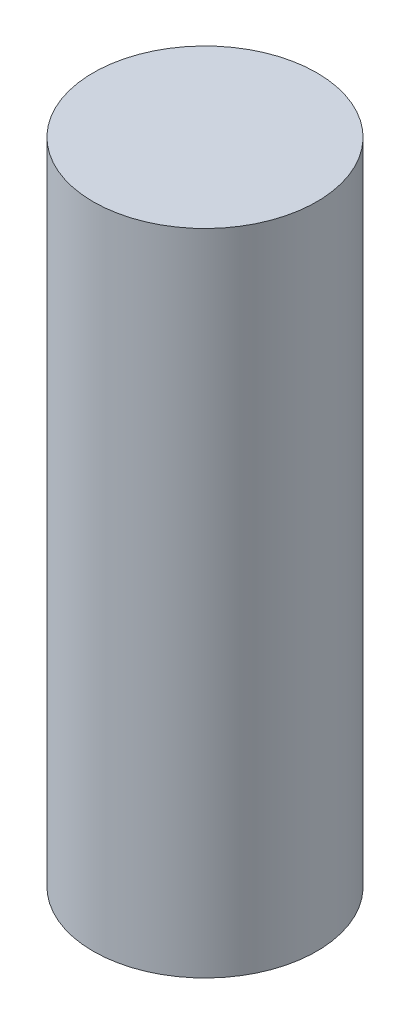
ISO-10303-21;
HEADER;
FILE_DESCRIPTION(('STEP AP214'),'2;1');
FILE_NAME('part.step','',(''),(''),'','','');
FILE_SCHEMA(('AUTOMOTIVE_DESIGN { 1 0 10303 214 1 1 1 1 }'));
ENDSEC;
DATA;
#1=APPLICATION_CONTEXT('core data for automotive mechanical design processes');
#2=APPLICATION_PROTOCOL_DEFINITION('international standard','automotive_design',2000,#1);
#3=PRODUCT_CONTEXT('',#1,'mechanical');
#4=PRODUCT('Part','Part','',(#3));
#5=PRODUCT_RELATED_PRODUCT_CATEGORY('part','',(#4));
#6=PRODUCT_DEFINITION_FORMATION('','',#4);
#7=PRODUCT_DEFINITION_CONTEXT('part definition',#1,'design');
#8=PRODUCT_DEFINITION('design','',#6,#7);
#9=PRODUCT_DEFINITION_SHAPE('','',#8);
#10=(LENGTH_UNIT() NAMED_UNIT(*) SI_UNIT(.MILLI.,.METRE.));
#11=(NAMED_UNIT(*) PLANE_ANGLE_UNIT() SI_UNIT($,.RADIAN.));
#12=(NAMED_UNIT(*) SI_UNIT($,.STERADIAN.) SOLID_ANGLE_UNIT());
#13=UNCERTAINTY_MEASURE_WITH_UNIT(LENGTH_MEASURE(1.E-05),#10,'distance_accuracy_value','');
#14=(GEOMETRIC_REPRESENTATION_CONTEXT(3) GLOBAL_UNCERTAINTY_ASSIGNED_CONTEXT((#13)) GLOBAL_UNIT_ASSIGNED_CONTEXT((#10,
#11,#12)) REPRESENTATION_CONTEXT('',''));
#15=CARTESIAN_POINT('',(0.,0.,0.));
#16=DIRECTION('',(0.,0.,1.));
#17=DIRECTION('',(1.,0.,0.));
#18=AXIS2_PLACEMENT_3D('',#15,#16,#17);
#19=CARTESIAN_POINT('',(0.,180.,0.));
#20=DIRECTION('',(0.,-1.,0.));
#21=DIRECTION('',(0.,0.,-1.));
#22=AXIS2_PLACEMENT_3D('',#19,#20,#21);
#23=CYLINDRICAL_SURFACE('',#22,31.);
#24=CARTESIAN_POINT('',(0.,180.,0.));
#25=DIRECTION('',(0.,1.,0.));
#26=DIRECTION('',(0.,0.,1.));
#27=AXIS2_PLACEMENT_3D('',#24,#25,#26);
#28=CIRCLE('',#27,31.);
#29=CARTESIAN_POINT('',(0.,180.,-31.));
#30=VERTEX_POINT('',#29);
#31=EDGE_CURVE('E10',#30,#30,#28,.T.);
#32=CARTESIAN_POINT('',(0.,0.,0.));
#33=DIRECTION('',(0.,1.,0.));
#34=DIRECTION('',(0.,0.,1.));
#35=AXIS2_PLACEMENT_3D('',#32,#33,#34);
#36=CIRCLE('',#35,31.);
#37=CARTESIAN_POINT('',(0.,0.,-31.));
#38=VERTEX_POINT('',#37);
#39=EDGE_CURVE('E34',#38,#38,#36,.T.);
#40=CARTESIAN_POINT('',(0.,180.,-31.));
#41=CARTESIAN_POINT('',(0.,178.125,-31.));
#42=CARTESIAN_POINT('',(0.,176.25,-31.));
#43=CARTESIAN_POINT('',(0.,172.5,-31.));
#44=CARTESIAN_POINT('',(0.,170.625,-31.));
#45=CARTESIAN_POINT('',(0.,166.875,-31.));
#46=CARTESIAN_POINT('',(0.,165.,-31.));
#47=CARTESIAN_POINT('',(0.,161.25,-31.));
#48=CARTESIAN_POINT('',(0.,159.375,-31.));
#49=CARTESIAN_POINT('',(0.,155.625,-31.));
#50=CARTESIAN_POINT('',(0.,153.75,-31.));
#51=CARTESIAN_POINT('',(0.,150.,-31.));
#52=CARTESIAN_POINT('',(0.,148.125,-31.));
#53=CARTESIAN_POINT('',(0.,144.375,-31.));
#54=CARTESIAN_POINT('',(0.,142.5,-31.));
#55=CARTESIAN_POINT('',(0.,138.75,-31.));
#56=CARTESIAN_POINT('',(0.,136.875,-31.));
#57=CARTESIAN_POINT('',(0.,133.125,-31.));
#58=CARTESIAN_POINT('',(0.,131.25,-31.));
#59=CARTESIAN_POINT('',(0.,127.5,-31.));
#60=CARTESIAN_POINT('',(0.,125.625,-31.));
#61=CARTESIAN_POINT('',(0.,121.875,-31.));
#62=CARTESIAN_POINT('',(0.,120.,-31.));
#63=CARTESIAN_POINT('',(0.,116.25,-31.));
#64=CARTESIAN_POINT('',(0.,114.375,-31.));
#65=CARTESIAN_POINT('',(0.,110.625,-31.));
#66=CARTESIAN_POINT('',(0.,108.75,-31.));
#67=CARTESIAN_POINT('',(0.,105.,-31.));
#68=CARTESIAN_POINT('',(0.,103.125,-31.));
#69=CARTESIAN_POINT('',(0.,99.375,-31.));
#70=CARTESIAN_POINT('',(0.,97.5,-31.));
#71=CARTESIAN_POINT('',(0.,93.75,-31.));
#72=CARTESIAN_POINT('',(0.,91.875,-31.));
#73=CARTESIAN_POINT('',(0.,88.125,-31.));
#74=CARTESIAN_POINT('',(0.,86.25,-31.));
#75=CARTESIAN_POINT('',(0.,82.5,-31.));
#76=CARTESIAN_POINT('',(0.,80.625,-31.));
#77=CARTESIAN_POINT('',(0.,76.875,-31.));
#78=CARTESIAN_POINT('',(0.,75.,-31.));
#79=CARTESIAN_POINT('',(0.,71.25,-31.));
#80=CARTESIAN_POINT('',(0.,69.375,-31.));
#81=CARTESIAN_POINT('',(0.,65.625,-31.));
#82=CARTESIAN_POINT('',(0.,63.75,-31.));
#83=CARTESIAN_POINT('',(0.,60.,-31.));
#84=CARTESIAN_POINT('',(0.,58.125,-31.));
#85=CARTESIAN_POINT('',(0.,54.375,-31.));
#86=CARTESIAN_POINT('',(0.,52.5,-31.));
#87=CARTESIAN_POINT('',(0.,48.75,-31.));
#88=CARTESIAN_POINT('',(0.,46.875,-31.));
#89=CARTESIAN_POINT('',(0.,43.125,-31.));
#90=CARTESIAN_POINT('',(0.,41.25,-31.));
#91=CARTESIAN_POINT('',(0.,37.5,-31.));
#92=CARTESIAN_POINT('',(0.,35.625,-31.));
#93=CARTESIAN_POINT('',(0.,31.875,-31.));
#94=CARTESIAN_POINT('',(0.,30.,-31.));
#95=CARTESIAN_POINT('',(0.,26.25,-31.));
#96=CARTESIAN_POINT('',(0.,24.375,-31.));
#97=CARTESIAN_POINT('',(0.,20.625,-31.));
#98=CARTESIAN_POINT('',(0.,18.75,-31.));
#99=CARTESIAN_POINT('',(0.,15.,-31.));
#100=CARTESIAN_POINT('',(0.,13.125,-31.));
#101=CARTESIAN_POINT('',(0.,9.37499999999998,-31.));
#102=CARTESIAN_POINT('',(0.,7.49999999999997,-31.));
#103=CARTESIAN_POINT('',(0.,3.74999999999997,-31.));
#104=CARTESIAN_POINT('',(0.,1.87499999999997,-31.));
#105=CARTESIAN_POINT('',(0.,0.,-31.));
#106=B_SPLINE_CURVE_WITH_KNOTS('',3,(#40,#41,#42,#43,#44,#45,#46,#47,#48,#49,#50,#51,#52,#53,
#54,#55,#56,#57,#58,#59,#60,#61,#62,#63,#64,#65,#66,#67,#68,#69,#70,#71,#72,#73,#74,#75,#76,#77,
#78,#79,#80,#81,#82,#83,#84,#85,#86,#87,#88,#89,#90,#91,#92,#93,#94,#95,#96,#97,#98,#99,#100,
#101,#102,#103,#104,#105),.UNSPECIFIED.,.F.,.F.,(4,2,2,2,2,2,2,2,2,2,2,2,2,2,2,2,2,2,2,2,2,2,2,
2,2,2,2,2,2,2,2,2,4),(0.,5.62500000000002,11.25,16.875,22.5,28.125,33.75,39.375,45.,50.625,
56.25,61.875,67.5,73.125,78.75,84.375,90.,95.625,101.25,106.875,112.5,118.125,123.75,129.375,
135.,140.625,146.25,151.875,157.5,163.125,168.75,174.375,180.),.UNSPECIFIED.);
#107=EDGE_CURVE('BSEAM31',#30,#38,#106,.T.);
#108=ORIENTED_EDGE('',*,*,#31,.F.);
#109=ORIENTED_EDGE('',*,*,#39,.T.);
#110=ORIENTED_EDGE('',*,*,#107,.T.);
#111=ORIENTED_EDGE('',*,*,#107,.F.);
#112=EDGE_LOOP('',(#108,#110,#109,#111));
#113=FACE_BOUND('',#112,.T.);
#114=ADVANCED_FACE('F31',(#113),#23,.T.);
#115=CARTESIAN_POINT('',(0.,180.,0.));
#116=DIRECTION('',(0.,1.,0.));
#117=DIRECTION('',(0.,0.,1.));
#118=AXIS2_PLACEMENT_3D('',#115,#116,#117);
#119=PLANE('',#118);
#120=ORIENTED_EDGE('',*,*,#31,.T.);
#121=EDGE_LOOP('',(#120));
#122=FACE_BOUND('',#121,.T.);
#123=ADVANCED_FACE('F46',(#122),#119,.T.);
#124=CARTESIAN_POINT('',(0.,0.,0.));
#125=DIRECTION('',(0.,1.,0.));
#126=DIRECTION('',(0.,0.,1.));
#127=AXIS2_PLACEMENT_3D('',#124,#125,#126);
#128=PLANE('',#127);
#129=ORIENTED_EDGE('',*,*,#39,.F.);
#130=EDGE_LOOP('',(#129));
#131=FACE_BOUND('',#130,.T.);
#132=ADVANCED_FACE('F44',(#131),#128,.F.);
#133=CLOSED_SHELL('',(#114,#123,#132));
#134=MANIFOLD_SOLID_BREP('B2',#133);
#135=ADVANCED_BREP_SHAPE_REPRESENTATION('',(#18,#134),#14);
#136=SHAPE_DEFINITION_REPRESENTATION(#9,#135);
ENDSEC;
END-ISO-10303-21;
